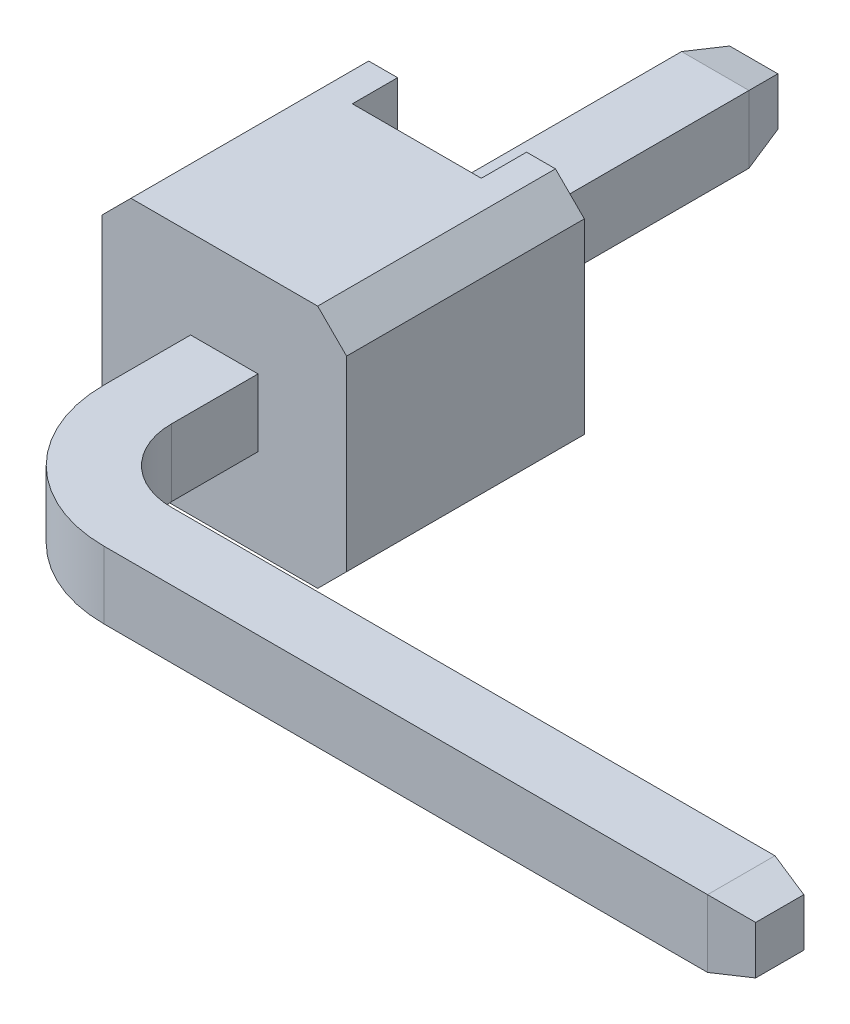
ISO-10303-21;
HEADER;
FILE_DESCRIPTION(('STEP AP214'),'2;1');
FILE_NAME('part.step','',(''),(''),'','','');
FILE_SCHEMA(('AUTOMOTIVE_DESIGN { 1 0 10303 214 1 1 1 1 }'));
ENDSEC;
DATA;
#1=APPLICATION_CONTEXT('core data for automotive mechanical design processes');
#2=APPLICATION_PROTOCOL_DEFINITION('international standard','automotive_design',2000,#1);
#3=PRODUCT_CONTEXT('',#1,'mechanical');
#4=PRODUCT('Part','Part','',(#3));
#5=PRODUCT_RELATED_PRODUCT_CATEGORY('part','',(#4));
#6=PRODUCT_DEFINITION_FORMATION('','',#4);
#7=PRODUCT_DEFINITION_CONTEXT('part definition',#1,'design');
#8=PRODUCT_DEFINITION('design','',#6,#7);
#9=PRODUCT_DEFINITION_SHAPE('','',#8);
#10=(LENGTH_UNIT() NAMED_UNIT(*) SI_UNIT(.MILLI.,.METRE.));
#11=(NAMED_UNIT(*) PLANE_ANGLE_UNIT() SI_UNIT($,.RADIAN.));
#12=(NAMED_UNIT(*) SI_UNIT($,.STERADIAN.) SOLID_ANGLE_UNIT());
#13=UNCERTAINTY_MEASURE_WITH_UNIT(LENGTH_MEASURE(1.E-05),#10,'distance_accuracy_value','');
#14=(GEOMETRIC_REPRESENTATION_CONTEXT(3) GLOBAL_UNCERTAINTY_ASSIGNED_CONTEXT((#13)) GLOBAL_UNIT_ASSIGNED_CONTEXT((#10,
#11,#12)) REPRESENTATION_CONTEXT('',''));
#15=CARTESIAN_POINT('',(0.,0.,0.));
#16=DIRECTION('',(0.,0.,1.));
#17=DIRECTION('',(1.,0.,0.));
#18=AXIS2_PLACEMENT_3D('',#15,#16,#17);
#19=CARTESIAN_POINT('',(0.,0.,0.5));
#20=DIRECTION('',(0.,0.,1.));
#21=DIRECTION('',(1.,0.,0.));
#22=AXIS2_PLACEMENT_3D('',#19,#20,#21);
#23=PLANE('',#22);
#24=DIRECTION('',(0.,-1.,0.));
#25=VECTOR('',#24,1.);
#26=CARTESIAN_POINT('',(-0.67,0.,0.5));
#27=LINE('',#26,#25);
#28=CARTESIAN_POINT('',(-0.67,1.27,0.5));
#29=VERTEX_POINT('',#28);
#30=CARTESIAN_POINT('',(-0.67,-1.27,0.5));
#31=VERTEX_POINT('',#30);
#32=EDGE_CURVE('E11',#29,#31,#27,.T.);
#33=ORIENTED_EDGE('',*,*,#32,.F.);
#34=DIRECTION('',(-1.,0.,0.));
#35=VECTOR('',#34,1.);
#36=CARTESIAN_POINT('',(-0.97,1.27,0.5));
#37=LINE('',#36,#35);
#38=CARTESIAN_POINT('',(0.67,1.27,0.5));
#39=VERTEX_POINT('',#38);
#40=EDGE_CURVE('E24',#39,#29,#37,.T.);
#41=ORIENTED_EDGE('',*,*,#40,.F.);
#42=DIRECTION('',(0.,1.,0.));
#43=VECTOR('',#42,1.);
#44=CARTESIAN_POINT('',(0.67,0.,0.5));
#45=LINE('',#44,#43);
#46=CARTESIAN_POINT('',(0.67,-1.27,0.5));
#47=VERTEX_POINT('',#46);
#48=EDGE_CURVE('E412',#47,#39,#45,.T.);
#49=ORIENTED_EDGE('',*,*,#48,.F.);
#50=DIRECTION('',(1.,0.,0.));
#51=VECTOR('',#50,1.);
#52=CARTESIAN_POINT('',(-0.97,-1.27,0.5));
#53=LINE('',#52,#51);
#54=EDGE_CURVE('E409',#31,#47,#53,.T.);
#55=ORIENTED_EDGE('',*,*,#54,.F.);
#56=EDGE_LOOP('',(#33,#41,#49,#55));
#57=FACE_BOUND('',#56,.T.);
#58=DIRECTION('',(0.,-1.,0.));
#59=VECTOR('',#58,1.);
#60=CARTESIAN_POINT('',(0.35,0.,0.5));
#61=LINE('',#60,#59);
#62=CARTESIAN_POINT('',(0.35,0.35,0.5));
#63=VERTEX_POINT('',#62);
#64=CARTESIAN_POINT('',(0.35,-0.35,0.5));
#65=VERTEX_POINT('',#64);
#66=EDGE_CURVE('E407',#63,#65,#61,.T.);
#67=ORIENTED_EDGE('',*,*,#66,.F.);
#68=DIRECTION('',(1.,0.,0.));
#69=VECTOR('',#68,1.);
#70=CARTESIAN_POINT('',(0.,0.35,0.5));
#71=LINE('',#70,#69);
#72=CARTESIAN_POINT('',(-0.35,0.35,0.5));
#73=VERTEX_POINT('',#72);
#74=EDGE_CURVE('E404',#73,#63,#71,.T.);
#75=ORIENTED_EDGE('',*,*,#74,.F.);
#76=DIRECTION('',(0.,1.,0.));
#77=VECTOR('',#76,1.);
#78=CARTESIAN_POINT('',(-0.35,0.,0.5));
#79=LINE('',#78,#77);
#80=CARTESIAN_POINT('',(-0.35,-0.35,0.5));
#81=VERTEX_POINT('',#80);
#82=EDGE_CURVE('E401',#81,#73,#79,.T.);
#83=ORIENTED_EDGE('',*,*,#82,.F.);
#84=DIRECTION('',(-1.,0.,0.));
#85=VECTOR('',#84,1.);
#86=CARTESIAN_POINT('',(0.,-0.35,0.5));
#87=LINE('',#86,#85);
#88=EDGE_CURVE('E398',#65,#81,#87,.T.);
#89=ORIENTED_EDGE('',*,*,#88,.F.);
#90=EDGE_LOOP('',(#67,#75,#83,#89));
#91=FACE_BOUND('',#90,.T.);
#92=ADVANCED_FACE('F17',(#57,#91),#23,.F.);
#93=CARTESIAN_POINT('',(0.,0.,2.5));
#94=DIRECTION('',(0.,0.,1.));
#95=DIRECTION('',(1.,0.,0.));
#96=AXIS2_PLACEMENT_3D('',#93,#94,#95);
#97=PLANE('',#96);
#98=DIRECTION('',(0.707106781186547,-0.707106781186548,0.));
#99=VECTOR('',#98,1.);
#100=CARTESIAN_POINT('',(-1.27,-0.97,2.5));
#101=LINE('',#100,#99);
#102=CARTESIAN_POINT('',(-1.27,-0.97,2.5));
#103=VERTEX_POINT('',#102);
#104=CARTESIAN_POINT('',(-0.97,-1.27,2.5));
#105=VERTEX_POINT('',#104);
#106=EDGE_CURVE('E396',#103,#105,#101,.T.);
#107=ORIENTED_EDGE('',*,*,#106,.T.);
#108=DIRECTION('',(1.,0.,0.));
#109=VECTOR('',#108,1.);
#110=CARTESIAN_POINT('',(-0.97,-1.27,2.5));
#111=LINE('',#110,#109);
#112=CARTESIAN_POINT('',(0.97,-1.27,2.5));
#113=VERTEX_POINT('',#112);
#114=EDGE_CURVE('E394',#105,#113,#111,.T.);
#115=ORIENTED_EDGE('',*,*,#114,.T.);
#116=DIRECTION('',(0.707106781186548,0.707106781186548,0.));
#117=VECTOR('',#116,1.);
#118=CARTESIAN_POINT('',(0.97,-1.27,2.5));
#119=LINE('',#118,#117);
#120=CARTESIAN_POINT('',(1.27,-0.97,2.5));
#121=VERTEX_POINT('',#120);
#122=EDGE_CURVE('E392',#113,#121,#119,.T.);
#123=ORIENTED_EDGE('',*,*,#122,.T.);
#124=DIRECTION('',(0.,1.,0.));
#125=VECTOR('',#124,1.);
#126=CARTESIAN_POINT('',(1.27,0.97,2.5));
#127=LINE('',#126,#125);
#128=CARTESIAN_POINT('',(1.27,0.97,2.5));
#129=VERTEX_POINT('',#128);
#130=EDGE_CURVE('E390',#121,#129,#127,.T.);
#131=ORIENTED_EDGE('',*,*,#130,.T.);
#132=DIRECTION('',(-0.707106781186548,0.707106781186548,0.));
#133=VECTOR('',#132,1.);
#134=CARTESIAN_POINT('',(0.97,1.27,2.5));
#135=LINE('',#134,#133);
#136=CARTESIAN_POINT('',(0.97,1.27,2.5));
#137=VERTEX_POINT('',#136);
#138=EDGE_CURVE('E388',#129,#137,#135,.T.);
#139=ORIENTED_EDGE('',*,*,#138,.T.);
#140=DIRECTION('',(-1.,0.,0.));
#141=VECTOR('',#140,1.);
#142=CARTESIAN_POINT('',(-0.97,1.27,2.5));
#143=LINE('',#142,#141);
#144=CARTESIAN_POINT('',(-0.97,1.27,2.5));
#145=VERTEX_POINT('',#144);
#146=EDGE_CURVE('E386',#137,#145,#143,.T.);
#147=ORIENTED_EDGE('',*,*,#146,.T.);
#148=DIRECTION('',(-0.707106781186548,-0.707106781186548,0.));
#149=VECTOR('',#148,1.);
#150=CARTESIAN_POINT('',(-1.27,0.97,2.5));
#151=LINE('',#150,#149);
#152=CARTESIAN_POINT('',(-1.27,0.97,2.5));
#153=VERTEX_POINT('',#152);
#154=EDGE_CURVE('E384',#145,#153,#151,.T.);
#155=ORIENTED_EDGE('',*,*,#154,.T.);
#156=DIRECTION('',(0.,-1.,0.));
#157=VECTOR('',#156,1.);
#158=CARTESIAN_POINT('',(-1.27,0.97,2.5));
#159=LINE('',#158,#157);
#160=EDGE_CURVE('E381',#153,#103,#159,.T.);
#161=ORIENTED_EDGE('',*,*,#160,.T.);
#162=EDGE_LOOP('',(#107,#115,#123,#131,#139,#147,#155,#161));
#163=FACE_BOUND('',#162,.T.);
#164=DIRECTION('',(1.,0.,0.));
#165=VECTOR('',#164,1.);
#166=CARTESIAN_POINT('',(0.,0.35,2.5));
#167=LINE('',#166,#165);
#168=CARTESIAN_POINT('',(-0.349999999999999,0.35,2.5));
#169=VERTEX_POINT('',#168);
#170=CARTESIAN_POINT('',(0.350000000000001,0.35,2.5));
#171=VERTEX_POINT('',#170);
#172=EDGE_CURVE('E379',#169,#171,#167,.T.);
#173=ORIENTED_EDGE('',*,*,#172,.T.);
#174=DIRECTION('',(0.,-1.,0.));
#175=VECTOR('',#174,1.);
#176=CARTESIAN_POINT('',(0.350000000000001,0.,2.5));
#177=LINE('',#176,#175);
#178=CARTESIAN_POINT('',(0.350000000000001,-0.35,2.5));
#179=VERTEX_POINT('',#178);
#180=EDGE_CURVE('E377',#171,#179,#177,.T.);
#181=ORIENTED_EDGE('',*,*,#180,.T.);
#182=DIRECTION('',(-1.,0.,0.));
#183=VECTOR('',#182,1.);
#184=CARTESIAN_POINT('',(0.,-0.35,2.5));
#185=LINE('',#184,#183);
#186=CARTESIAN_POINT('',(-0.35,-0.35,2.5));
#187=VERTEX_POINT('',#186);
#188=EDGE_CURVE('E375',#179,#187,#185,.T.);
#189=ORIENTED_EDGE('',*,*,#188,.T.);
#190=DIRECTION('',(0.,1.,0.));
#191=VECTOR('',#190,1.);
#192=CARTESIAN_POINT('',(-0.349999999999999,0.,2.5));
#193=LINE('',#192,#191);
#194=EDGE_CURVE('E372',#187,#169,#193,.T.);
#195=ORIENTED_EDGE('',*,*,#194,.T.);
#196=EDGE_LOOP('',(#173,#181,#189,#195));
#197=FACE_BOUND('',#196,.T.);
#198=ADVANCED_FACE('F435',(#163,#197),#97,.T.);
#199=CARTESIAN_POINT('',(-1.27,-0.97,2.5));
#200=DIRECTION('',(0.707106781186548,0.707106781186548,0.));
#201=DIRECTION('',(-0.707106781186548,0.707106781186548,0.));
#202=AXIS2_PLACEMENT_3D('',#199,#200,#201);
#203=PLANE('',#202);
#204=DIRECTION('',(0.,0.,-1.));
#205=VECTOR('',#204,1.);
#206=CARTESIAN_POINT('',(-1.27,-0.97,2.5));
#207=LINE('',#206,#205);
#208=CARTESIAN_POINT('',(-1.27,-0.97,0.03));
#209=VERTEX_POINT('',#208);
#210=EDGE_CURVE('E370',#103,#209,#207,.T.);
#211=ORIENTED_EDGE('',*,*,#210,.T.);
#212=DIRECTION('',(0.707106781186547,-0.707106781186548,0.));
#213=VECTOR('',#212,1.);
#214=CARTESIAN_POINT('',(-1.27,-0.97,0.03));
#215=LINE('',#214,#213);
#216=CARTESIAN_POINT('',(-0.97,-1.27,0.03));
#217=VERTEX_POINT('',#216);
#218=EDGE_CURVE('E368',#209,#217,#215,.T.);
#219=ORIENTED_EDGE('',*,*,#218,.T.);
#220=DIRECTION('',(0.,0.,-1.));
#221=VECTOR('',#220,1.);
#222=CARTESIAN_POINT('',(-0.97,-1.27,2.5));
#223=LINE('',#222,#221);
#224=EDGE_CURVE('E365',#105,#217,#223,.T.);
#225=ORIENTED_EDGE('',*,*,#224,.F.);
#226=ORIENTED_EDGE('',*,*,#106,.F.);
#227=EDGE_LOOP('',(#211,#219,#225,#226));
#228=FACE_BOUND('',#227,.T.);
#229=ADVANCED_FACE('F441',(#228),#203,.F.);
#230=CARTESIAN_POINT('',(-0.97,-1.27,2.5));
#231=DIRECTION('',(0.,1.,0.));
#232=DIRECTION('',(0.,0.,1.));
#233=AXIS2_PLACEMENT_3D('',#230,#231,#232);
#234=PLANE('',#233);
#235=ORIENTED_EDGE('',*,*,#224,.T.);
#236=DIRECTION('',(1.,0.,0.));
#237=VECTOR('',#236,1.);
#238=CARTESIAN_POINT('',(-0.97,-1.27,0.03));
#239=LINE('',#238,#237);
#240=CARTESIAN_POINT('',(-0.67,-1.27,0.03));
#241=VERTEX_POINT('',#240);
#242=EDGE_CURVE('E363',#217,#241,#239,.T.);
#243=ORIENTED_EDGE('',*,*,#242,.T.);
#244=DIRECTION('',(0.,0.,-1.));
#245=VECTOR('',#244,1.);
#246=CARTESIAN_POINT('',(-0.67,-1.27,0.53));
#247=LINE('',#246,#245);
#248=EDGE_CURVE('E361',#31,#241,#247,.T.);
#249=ORIENTED_EDGE('',*,*,#248,.F.);
#250=ORIENTED_EDGE('',*,*,#54,.T.);
#251=DIRECTION('',(0.,0.,-1.));
#252=VECTOR('',#251,1.);
#253=CARTESIAN_POINT('',(0.67,-1.27,0.53));
#254=LINE('',#253,#252);
#255=CARTESIAN_POINT('',(0.67,-1.27,0.03));
#256=VERTEX_POINT('',#255);
#257=EDGE_CURVE('E359',#47,#256,#254,.T.);
#258=ORIENTED_EDGE('',*,*,#257,.T.);
#259=DIRECTION('',(1.,0.,0.));
#260=VECTOR('',#259,1.);
#261=CARTESIAN_POINT('',(0.67,-1.27,0.03));
#262=LINE('',#261,#260);
#263=CARTESIAN_POINT('',(0.97,-1.27,0.03));
#264=VERTEX_POINT('',#263);
#265=EDGE_CURVE('E357',#256,#264,#262,.T.);
#266=ORIENTED_EDGE('',*,*,#265,.T.);
#267=DIRECTION('',(0.,0.,-1.));
#268=VECTOR('',#267,1.);
#269=CARTESIAN_POINT('',(0.97,-1.27,2.5));
#270=LINE('',#269,#268);
#271=EDGE_CURVE('E354',#113,#264,#270,.T.);
#272=ORIENTED_EDGE('',*,*,#271,.F.);
#273=ORIENTED_EDGE('',*,*,#114,.F.);
#274=EDGE_LOOP('',(#235,#243,#249,#250,#258,#266,#272,#273));
#275=FACE_BOUND('',#274,.T.);
#276=ADVANCED_FACE('F447',(#275),#234,.F.);
#277=CARTESIAN_POINT('',(0.970000000000001,-1.27,2.5));
#278=DIRECTION('',(-0.707106781186548,0.707106781186548,0.));
#279=DIRECTION('',(-0.707106781186548,-0.707106781186548,0.));
#280=AXIS2_PLACEMENT_3D('',#277,#278,#279);
#281=PLANE('',#280);
#282=ORIENTED_EDGE('',*,*,#271,.T.);
#283=DIRECTION('',(0.707106781186548,0.707106781186548,0.));
#284=VECTOR('',#283,1.);
#285=CARTESIAN_POINT('',(0.97,-1.27,0.03));
#286=LINE('',#285,#284);
#287=CARTESIAN_POINT('',(1.27,-0.97,0.03));
#288=VERTEX_POINT('',#287);
#289=EDGE_CURVE('E352',#264,#288,#286,.T.);
#290=ORIENTED_EDGE('',*,*,#289,.T.);
#291=DIRECTION('',(0.,0.,-1.));
#292=VECTOR('',#291,1.);
#293=CARTESIAN_POINT('',(1.27,-0.97,2.5));
#294=LINE('',#293,#292);
#295=EDGE_CURVE('E349',#121,#288,#294,.T.);
#296=ORIENTED_EDGE('',*,*,#295,.F.);
#297=ORIENTED_EDGE('',*,*,#122,.F.);
#298=EDGE_LOOP('',(#282,#290,#296,#297));
#299=FACE_BOUND('',#298,.T.);
#300=ADVANCED_FACE('F451',(#299),#281,.F.);
#301=CARTESIAN_POINT('',(1.27,0.970000000000001,2.5));
#302=DIRECTION('',(-1.,0.,0.));
#303=DIRECTION('',(0.,-1.,0.));
#304=AXIS2_PLACEMENT_3D('',#301,#302,#303);
#305=PLANE('',#304);
#306=ORIENTED_EDGE('',*,*,#295,.T.);
#307=DIRECTION('',(0.,1.,0.));
#308=VECTOR('',#307,1.);
#309=CARTESIAN_POINT('',(1.27,-0.97,0.03));
#310=LINE('',#309,#308);
#311=CARTESIAN_POINT('',(1.27,0.97,0.03));
#312=VERTEX_POINT('',#311);
#313=EDGE_CURVE('E347',#288,#312,#310,.T.);
#314=ORIENTED_EDGE('',*,*,#313,.T.);
#315=DIRECTION('',(0.,0.,-1.));
#316=VECTOR('',#315,1.);
#317=CARTESIAN_POINT('',(1.27,0.97,2.5));
#318=LINE('',#317,#316);
#319=EDGE_CURVE('E344',#129,#312,#318,.T.);
#320=ORIENTED_EDGE('',*,*,#319,.F.);
#321=ORIENTED_EDGE('',*,*,#130,.F.);
#322=EDGE_LOOP('',(#306,#314,#320,#321));
#323=FACE_BOUND('',#322,.T.);
#324=ADVANCED_FACE('F461',(#323),#305,.F.);
#325=CARTESIAN_POINT('',(0.97,1.27,2.5));
#326=DIRECTION('',(-0.707106781186548,-0.707106781186548,0.));
#327=DIRECTION('',(0.707106781186548,-0.707106781186548,0.));
#328=AXIS2_PLACEMENT_3D('',#325,#326,#327);
#329=PLANE('',#328);
#330=ORIENTED_EDGE('',*,*,#319,.T.);
#331=DIRECTION('',(-0.707106781186548,0.707106781186548,0.));
#332=VECTOR('',#331,1.);
#333=CARTESIAN_POINT('',(1.27,0.97,0.03));
#334=LINE('',#333,#332);
#335=CARTESIAN_POINT('',(0.97,1.27,0.03));
#336=VERTEX_POINT('',#335);
#337=EDGE_CURVE('E342',#312,#336,#334,.T.);
#338=ORIENTED_EDGE('',*,*,#337,.T.);
#339=DIRECTION('',(0.,0.,-1.));
#340=VECTOR('',#339,1.);
#341=CARTESIAN_POINT('',(0.97,1.27,2.5));
#342=LINE('',#341,#340);
#343=EDGE_CURVE('E339',#137,#336,#342,.T.);
#344=ORIENTED_EDGE('',*,*,#343,.F.);
#345=ORIENTED_EDGE('',*,*,#138,.F.);
#346=EDGE_LOOP('',(#330,#338,#344,#345));
#347=FACE_BOUND('',#346,.T.);
#348=ADVANCED_FACE('F465',(#347),#329,.F.);
#349=CARTESIAN_POINT('',(-0.97,1.27,2.5));
#350=DIRECTION('',(0.,-1.,0.));
#351=DIRECTION('',(0.,0.,-1.));
#352=AXIS2_PLACEMENT_3D('',#349,#350,#351);
#353=PLANE('',#352);
#354=ORIENTED_EDGE('',*,*,#40,.T.);
#355=DIRECTION('',(0.,0.,-1.));
#356=VECTOR('',#355,1.);
#357=CARTESIAN_POINT('',(-0.67,1.27,0.53));
#358=LINE('',#357,#356);
#359=CARTESIAN_POINT('',(-0.67,1.27,0.03));
#360=VERTEX_POINT('',#359);
#361=EDGE_CURVE('E337',#29,#360,#358,.T.);
#362=ORIENTED_EDGE('',*,*,#361,.T.);
#363=DIRECTION('',(-1.,0.,0.));
#364=VECTOR('',#363,1.);
#365=CARTESIAN_POINT('',(-0.67,1.27,0.03));
#366=LINE('',#365,#364);
#367=CARTESIAN_POINT('',(-0.97,1.27,0.03));
#368=VERTEX_POINT('',#367);
#369=EDGE_CURVE('E335',#360,#368,#366,.T.);
#370=ORIENTED_EDGE('',*,*,#369,.T.);
#371=DIRECTION('',(0.,0.,-1.));
#372=VECTOR('',#371,1.);
#373=CARTESIAN_POINT('',(-0.97,1.27,2.5));
#374=LINE('',#373,#372);
#375=EDGE_CURVE('E332',#145,#368,#374,.T.);
#376=ORIENTED_EDGE('',*,*,#375,.F.);
#377=ORIENTED_EDGE('',*,*,#146,.F.);
#378=ORIENTED_EDGE('',*,*,#343,.T.);
#379=DIRECTION('',(-1.,0.,0.));
#380=VECTOR('',#379,1.);
#381=CARTESIAN_POINT('',(0.97,1.27,0.03));
#382=LINE('',#381,#380);
#383=CARTESIAN_POINT('',(0.67,1.27,0.03));
#384=VERTEX_POINT('',#383);
#385=EDGE_CURVE('E330',#336,#384,#382,.T.);
#386=ORIENTED_EDGE('',*,*,#385,.T.);
#387=DIRECTION('',(0.,0.,-1.));
#388=VECTOR('',#387,1.);
#389=CARTESIAN_POINT('',(0.67,1.27,0.53));
#390=LINE('',#389,#388);
#391=EDGE_CURVE('E327',#39,#384,#390,.T.);
#392=ORIENTED_EDGE('',*,*,#391,.F.);
#393=EDGE_LOOP('',(#354,#362,#370,#376,#377,#378,#386,#392));
#394=FACE_BOUND('',#393,.T.);
#395=ADVANCED_FACE('F416',(#394),#353,.F.);
#396=CARTESIAN_POINT('',(-1.27,0.970000000000001,2.5));
#397=DIRECTION('',(0.707106781186548,-0.707106781186548,0.));
#398=DIRECTION('',(0.707106781186548,0.707106781186548,0.));
#399=AXIS2_PLACEMENT_3D('',#396,#397,#398);
#400=PLANE('',#399);
#401=ORIENTED_EDGE('',*,*,#375,.T.);
#402=DIRECTION('',(-0.707106781186548,-0.707106781186548,0.));
#403=VECTOR('',#402,1.);
#404=CARTESIAN_POINT('',(-0.97,1.27,0.03));
#405=LINE('',#404,#403);
#406=CARTESIAN_POINT('',(-1.27,0.97,0.03));
#407=VERTEX_POINT('',#406);
#408=EDGE_CURVE('E325',#368,#407,#405,.T.);
#409=ORIENTED_EDGE('',*,*,#408,.T.);
#410=DIRECTION('',(0.,0.,-1.));
#411=VECTOR('',#410,1.);
#412=CARTESIAN_POINT('',(-1.27,0.97,2.5));
#413=LINE('',#412,#411);
#414=EDGE_CURVE('E322',#153,#407,#413,.T.);
#415=ORIENTED_EDGE('',*,*,#414,.F.);
#416=ORIENTED_EDGE('',*,*,#154,.F.);
#417=EDGE_LOOP('',(#401,#409,#415,#416));
#418=FACE_BOUND('',#417,.T.);
#419=ADVANCED_FACE('F431',(#418),#400,.F.);
#420=CARTESIAN_POINT('',(-1.27,0.970000000000001,2.5));
#421=DIRECTION('',(1.,0.,0.));
#422=DIRECTION('',(0.,1.,0.));
#423=AXIS2_PLACEMENT_3D('',#420,#421,#422);
#424=PLANE('',#423);
#425=ORIENTED_EDGE('',*,*,#414,.T.);
#426=DIRECTION('',(0.,-1.,0.));
#427=VECTOR('',#426,1.);
#428=CARTESIAN_POINT('',(-1.27,0.97,0.03));
#429=LINE('',#428,#427);
#430=EDGE_CURVE('E319',#407,#209,#429,.T.);
#431=ORIENTED_EDGE('',*,*,#430,.T.);
#432=ORIENTED_EDGE('',*,*,#210,.F.);
#433=ORIENTED_EDGE('',*,*,#160,.F.);
#434=EDGE_LOOP('',(#425,#431,#432,#433));
#435=FACE_BOUND('',#434,.T.);
#436=ADVANCED_FACE('F439',(#435),#424,.F.);
#437=CARTESIAN_POINT('',(0.67,1.27,0.53));
#438=DIRECTION('',(1.,0.,0.));
#439=DIRECTION('',(0.,0.,-1.));
#440=AXIS2_PLACEMENT_3D('',#437,#438,#439);
#441=PLANE('',#440);
#442=ORIENTED_EDGE('',*,*,#257,.F.);
#443=ORIENTED_EDGE('',*,*,#48,.T.);
#444=ORIENTED_EDGE('',*,*,#391,.T.);
#445=DIRECTION('',(0.,-1.,0.));
#446=VECTOR('',#445,1.);
#447=CARTESIAN_POINT('',(0.67,1.27,0.03));
#448=LINE('',#447,#446);
#449=EDGE_CURVE('E316',#384,#256,#448,.T.);
#450=ORIENTED_EDGE('',*,*,#449,.T.);
#451=EDGE_LOOP('',(#442,#443,#444,#450));
#452=FACE_BOUND('',#451,.T.);
#453=ADVANCED_FACE('F469',(#452),#441,.F.);
#454=CARTESIAN_POINT('',(0.,0.,0.03));
#455=DIRECTION('',(0.,0.,1.));
#456=DIRECTION('',(1.,0.,0.));
#457=AXIS2_PLACEMENT_3D('',#454,#455,#456);
#458=PLANE('',#457);
#459=ORIENTED_EDGE('',*,*,#449,.F.);
#460=ORIENTED_EDGE('',*,*,#385,.F.);
#461=ORIENTED_EDGE('',*,*,#337,.F.);
#462=ORIENTED_EDGE('',*,*,#313,.F.);
#463=ORIENTED_EDGE('',*,*,#289,.F.);
#464=ORIENTED_EDGE('',*,*,#265,.F.);
#465=EDGE_LOOP('',(#459,#460,#461,#462,#463,#464));
#466=FACE_BOUND('',#465,.T.);
#467=ADVANCED_FACE('F456',(#466),#458,.F.);
#468=CARTESIAN_POINT('',(-0.67,1.27,0.53));
#469=DIRECTION('',(-1.,0.,0.));
#470=DIRECTION('',(0.,0.,1.));
#471=AXIS2_PLACEMENT_3D('',#468,#469,#470);
#472=PLANE('',#471);
#473=ORIENTED_EDGE('',*,*,#361,.F.);
#474=ORIENTED_EDGE('',*,*,#32,.T.);
#475=ORIENTED_EDGE('',*,*,#248,.T.);
#476=DIRECTION('',(0.,1.,0.));
#477=VECTOR('',#476,1.);
#478=CARTESIAN_POINT('',(-0.67,1.27,0.03));
#479=LINE('',#478,#477);
#480=EDGE_CURVE('E313',#241,#360,#479,.T.);
#481=ORIENTED_EDGE('',*,*,#480,.T.);
#482=EDGE_LOOP('',(#473,#474,#475,#481));
#483=FACE_BOUND('',#482,.T.);
#484=ADVANCED_FACE('F418',(#483),#472,.F.);
#485=CARTESIAN_POINT('',(0.,0.,0.03));
#486=DIRECTION('',(0.,0.,1.));
#487=DIRECTION('',(1.,0.,0.));
#488=AXIS2_PLACEMENT_3D('',#485,#486,#487);
#489=PLANE('',#488);
#490=ORIENTED_EDGE('',*,*,#480,.F.);
#491=ORIENTED_EDGE('',*,*,#242,.F.);
#492=ORIENTED_EDGE('',*,*,#218,.F.);
#493=ORIENTED_EDGE('',*,*,#430,.F.);
#494=ORIENTED_EDGE('',*,*,#408,.F.);
#495=ORIENTED_EDGE('',*,*,#369,.F.);
#496=EDGE_LOOP('',(#490,#491,#492,#493,#494,#495));
#497=FACE_BOUND('',#496,.T.);
#498=ADVANCED_FACE('F423',(#497),#489,.F.);
#499=CARTESIAN_POINT('',(1.1,0.,3.4));
#500=DIRECTION('',(0.,1.,0.));
#501=DIRECTION('',(0.,0.,1.));
#502=AXIS2_PLACEMENT_3D('',#499,#500,#501);
#503=CYLINDRICAL_SURFACE('',#502,1.45);
#504=DIRECTION('',(0.,-1.,0.));
#505=VECTOR('',#504,1.);
#506=CARTESIAN_POINT('',(-0.349999999999999,0.35,3.4));
#507=LINE('',#506,#505);
#508=CARTESIAN_POINT('',(-0.349999999999999,0.35,3.4));
#509=VERTEX_POINT('',#508);
#510=CARTESIAN_POINT('',(-0.349999999999999,-0.35,3.4));
#511=VERTEX_POINT('',#510);
#512=EDGE_CURVE('E311',#509,#511,#507,.T.);
#513=ORIENTED_EDGE('',*,*,#512,.T.);
#514=CARTESIAN_POINT('',(1.1,-0.35,3.4));
#515=DIRECTION('',(0.,1.,0.));
#516=DIRECTION('',(0.,0.,1.));
#517=AXIS2_PLACEMENT_3D('',#514,#515,#516);
#518=CIRCLE('',#517,1.45);
#519=CARTESIAN_POINT('',(1.1,-0.35,4.85));
#520=VERTEX_POINT('',#519);
#521=EDGE_CURVE('E309',#511,#520,#518,.T.);
#522=ORIENTED_EDGE('',*,*,#521,.T.);
#523=DIRECTION('',(0.,-1.,0.));
#524=VECTOR('',#523,1.);
#525=CARTESIAN_POINT('',(1.1,0.35,4.85));
#526=LINE('',#525,#524);
#527=CARTESIAN_POINT('',(1.1,0.35,4.85));
#528=VERTEX_POINT('',#527);
#529=EDGE_CURVE('E306',#528,#520,#526,.T.);
#530=ORIENTED_EDGE('',*,*,#529,.F.);
#531=CARTESIAN_POINT('',(1.1,0.35,3.4));
#532=DIRECTION('',(0.,1.,0.));
#533=DIRECTION('',(0.,0.,1.));
#534=AXIS2_PLACEMENT_3D('',#531,#532,#533);
#535=CIRCLE('',#534,1.45);
#536=EDGE_CURVE('E303',#509,#528,#535,.T.);
#537=ORIENTED_EDGE('',*,*,#536,.F.);
#538=EDGE_LOOP('',(#513,#522,#530,#537));
#539=FACE_BOUND('',#538,.T.);
#540=ADVANCED_FACE('F537',(#539),#503,.T.);
#541=CARTESIAN_POINT('',(1.1,0.35,4.85));
#542=DIRECTION('',(0.,0.,1.));
#543=DIRECTION('',(0.,-1.,0.));
#544=AXIS2_PLACEMENT_3D('',#541,#542,#543);
#545=PLANE('',#544);
#546=DIRECTION('',(1.,0.,0.));
#547=VECTOR('',#546,1.);
#548=CARTESIAN_POINT('',(1.1,-0.35,4.85));
#549=LINE('',#548,#547);
#550=CARTESIAN_POINT('',(7.36999999999999,-0.35,4.85));
#551=VERTEX_POINT('',#550);
#552=EDGE_CURVE('E301',#520,#551,#549,.T.);
#553=ORIENTED_EDGE('',*,*,#552,.T.);
#554=DIRECTION('',(0.,1.,0.));
#555=VECTOR('',#554,1.);
#556=CARTESIAN_POINT('',(7.36999999999999,0.35,4.85));
#557=LINE('',#556,#555);
#558=CARTESIAN_POINT('',(7.36999999999999,0.35,4.85));
#559=VERTEX_POINT('',#558);
#560=EDGE_CURVE('E299',#551,#559,#557,.T.);
#561=ORIENTED_EDGE('',*,*,#560,.T.);
#562=DIRECTION('',(1.,0.,0.));
#563=VECTOR('',#562,1.);
#564=CARTESIAN_POINT('',(1.1,0.35,4.85));
#565=LINE('',#564,#563);
#566=EDGE_CURVE('E296',#528,#559,#565,.T.);
#567=ORIENTED_EDGE('',*,*,#566,.F.);
#568=ORIENTED_EDGE('',*,*,#529,.T.);
#569=EDGE_LOOP('',(#553,#561,#567,#568));
#570=FACE_BOUND('',#569,.T.);
#571=ADVANCED_FACE('F533',(#570),#545,.T.);
#572=CARTESIAN_POINT('',(7.77,0.,4.5));
#573=DIRECTION('',(1.,0.,0.));
#574=DIRECTION('',(0.,0.,-1.));
#575=AXIS2_PLACEMENT_3D('',#572,#573,#574);
#576=PLANE('',#575);
#577=DIRECTION('',(0.,-1.,0.));
#578=VECTOR('',#577,1.);
#579=CARTESIAN_POINT('',(7.77,0.,4.75));
#580=LINE('',#579,#578);
#581=CARTESIAN_POINT('',(7.77,0.25,4.75));
#582=VERTEX_POINT('',#581);
#583=CARTESIAN_POINT('',(7.77,-0.25,4.75));
#584=VERTEX_POINT('',#583);
#585=EDGE_CURVE('E294',#582,#584,#580,.T.);
#586=ORIENTED_EDGE('',*,*,#585,.T.);
#587=DIRECTION('',(0.,0.,-1.));
#588=VECTOR('',#587,1.);
#589=CARTESIAN_POINT('',(7.77,-0.25,4.15));
#590=LINE('',#589,#588);
#591=CARTESIAN_POINT('',(7.77,-0.25,4.25));
#592=VERTEX_POINT('',#591);
#593=EDGE_CURVE('E292',#584,#592,#590,.T.);
#594=ORIENTED_EDGE('',*,*,#593,.T.);
#595=DIRECTION('',(0.,1.,0.));
#596=VECTOR('',#595,1.);
#597=CARTESIAN_POINT('',(7.77,0.,4.25));
#598=LINE('',#597,#596);
#599=CARTESIAN_POINT('',(7.77,0.25,4.25));
#600=VERTEX_POINT('',#599);
#601=EDGE_CURVE('E290',#592,#600,#598,.T.);
#602=ORIENTED_EDGE('',*,*,#601,.T.);
#603=DIRECTION('',(0.,0.,1.));
#604=VECTOR('',#603,1.);
#605=CARTESIAN_POINT('',(7.77,0.25,4.85));
#606=LINE('',#605,#604);
#607=EDGE_CURVE('E287',#600,#582,#606,.T.);
#608=ORIENTED_EDGE('',*,*,#607,.T.);
#609=EDGE_LOOP('',(#586,#594,#602,#608));
#610=FACE_BOUND('',#609,.T.);
#611=ADVANCED_FACE('F529',(#610),#576,.T.);
#612=CARTESIAN_POINT('',(1.1,0.35,4.15));
#613=DIRECTION('',(0.,0.,-1.));
#614=DIRECTION('',(0.,1.,0.));
#615=AXIS2_PLACEMENT_3D('',#612,#613,#614);
#616=PLANE('',#615);
#617=DIRECTION('',(1.,0.,0.));
#618=VECTOR('',#617,1.);
#619=CARTESIAN_POINT('',(1.1,0.35,4.15));
#620=LINE('',#619,#618);
#621=CARTESIAN_POINT('',(1.1,0.35,4.15));
#622=VERTEX_POINT('',#621);
#623=CARTESIAN_POINT('',(7.36999999999999,0.35,4.15));
#624=VERTEX_POINT('',#623);
#625=EDGE_CURVE('E285',#622,#624,#620,.T.);
#626=ORIENTED_EDGE('',*,*,#625,.T.);
#627=DIRECTION('',(0.,-1.,0.));
#628=VECTOR('',#627,1.);
#629=CARTESIAN_POINT('',(7.36999999999999,0.35,4.15));
#630=LINE('',#629,#628);
#631=CARTESIAN_POINT('',(7.36999999999999,-0.35,4.15));
#632=VERTEX_POINT('',#631);
#633=EDGE_CURVE('E283',#624,#632,#630,.T.);
#634=ORIENTED_EDGE('',*,*,#633,.T.);
#635=DIRECTION('',(1.,0.,0.));
#636=VECTOR('',#635,1.);
#637=CARTESIAN_POINT('',(1.1,-0.35,4.15));
#638=LINE('',#637,#636);
#639=CARTESIAN_POINT('',(1.1,-0.35,4.15));
#640=VERTEX_POINT('',#639);
#641=EDGE_CURVE('E280',#640,#632,#638,.T.);
#642=ORIENTED_EDGE('',*,*,#641,.F.);
#643=DIRECTION('',(0.,1.,0.));
#644=VECTOR('',#643,1.);
#645=CARTESIAN_POINT('',(1.1,0.35,4.15));
#646=LINE('',#645,#644);
#647=EDGE_CURVE('E277',#640,#622,#646,.T.);
#648=ORIENTED_EDGE('',*,*,#647,.T.);
#649=EDGE_LOOP('',(#626,#634,#642,#648));
#650=FACE_BOUND('',#649,.T.);
#651=ADVANCED_FACE('F525',(#650),#616,.T.);
#652=CARTESIAN_POINT('',(1.1,0.,3.4));
#653=DIRECTION('',(0.,1.,0.));
#654=DIRECTION('',(0.,0.,1.));
#655=AXIS2_PLACEMENT_3D('',#652,#653,#654);
#656=CYLINDRICAL_SURFACE('',#655,0.75);
#657=DIRECTION('',(0.,1.,0.));
#658=VECTOR('',#657,1.);
#659=CARTESIAN_POINT('',(0.350000000000001,0.35,3.4));
#660=LINE('',#659,#658);
#661=CARTESIAN_POINT('',(0.350000000000001,-0.35,3.4));
#662=VERTEX_POINT('',#661);
#663=CARTESIAN_POINT('',(0.350000000000001,0.35,3.4));
#664=VERTEX_POINT('',#663);
#665=EDGE_CURVE('E274',#662,#664,#660,.T.);
#666=ORIENTED_EDGE('',*,*,#665,.T.);
#667=CARTESIAN_POINT('',(1.1,0.35,3.4));
#668=DIRECTION('',(0.,1.,0.));
#669=DIRECTION('',(0.,0.,1.));
#670=AXIS2_PLACEMENT_3D('',#667,#668,#669);
#671=CIRCLE('',#670,0.75);
#672=EDGE_CURVE('E271',#664,#622,#671,.T.);
#673=ORIENTED_EDGE('',*,*,#672,.T.);
#674=ORIENTED_EDGE('',*,*,#647,.F.);
#675=CARTESIAN_POINT('',(1.1,-0.35,3.4));
#676=DIRECTION('',(0.,1.,0.));
#677=DIRECTION('',(0.,0.,1.));
#678=AXIS2_PLACEMENT_3D('',#675,#676,#677);
#679=CIRCLE('',#678,0.75);
#680=EDGE_CURVE('E268',#662,#640,#679,.T.);
#681=ORIENTED_EDGE('',*,*,#680,.F.);
#682=EDGE_LOOP('',(#666,#673,#674,#681));
#683=FACE_BOUND('',#682,.T.);
#684=ADVANCED_FACE('F521',(#683),#656,.F.);
#685=CARTESIAN_POINT('',(-0.349999999999999,-0.35,3.4));
#686=DIRECTION('',(0.,1.,0.));
#687=DIRECTION('',(0.,0.,1.));
#688=AXIS2_PLACEMENT_3D('',#685,#686,#687);
#689=PLANE('',#688);
#690=ORIENTED_EDGE('',*,*,#641,.T.);
#691=DIRECTION('',(0.,0.,1.));
#692=VECTOR('',#691,1.);
#693=CARTESIAN_POINT('',(7.36999999999999,-0.35,4.85));
#694=LINE('',#693,#692);
#695=EDGE_CURVE('E265',#632,#551,#694,.T.);
#696=ORIENTED_EDGE('',*,*,#695,.T.);
#697=ORIENTED_EDGE('',*,*,#552,.F.);
#698=ORIENTED_EDGE('',*,*,#521,.F.);
#699=DIRECTION('',(0.,0.,-1.));
#700=VECTOR('',#699,1.);
#701=CARTESIAN_POINT('',(-0.349999999999999,-0.35,3.4));
#702=LINE('',#701,#700);
#703=EDGE_CURVE('E262',#511,#187,#702,.T.);
#704=ORIENTED_EDGE('',*,*,#703,.T.);
#705=ORIENTED_EDGE('',*,*,#188,.F.);
#706=DIRECTION('',(0.,0.,-1.));
#707=VECTOR('',#706,1.);
#708=CARTESIAN_POINT('',(0.350000000000001,-0.35,3.4));
#709=LINE('',#708,#707);
#710=EDGE_CURVE('E259',#662,#179,#709,.T.);
#711=ORIENTED_EDGE('',*,*,#710,.F.);
#712=ORIENTED_EDGE('',*,*,#680,.T.);
#713=EDGE_LOOP('',(#690,#696,#697,#698,#704,#705,#711,#712));
#714=FACE_BOUND('',#713,.T.);
#715=ADVANCED_FACE('F517',(#714),#689,.F.);
#716=CARTESIAN_POINT('',(-0.349999999999999,0.35,3.4));
#717=DIRECTION('',(1.,0.,0.));
#718=DIRECTION('',(0.,1.,0.));
#719=AXIS2_PLACEMENT_3D('',#716,#717,#718);
#720=PLANE('',#719);
#721=ORIENTED_EDGE('',*,*,#194,.F.);
#722=ORIENTED_EDGE('',*,*,#703,.F.);
#723=ORIENTED_EDGE('',*,*,#512,.F.);
#724=DIRECTION('',(0.,0.,-1.));
#725=VECTOR('',#724,1.);
#726=CARTESIAN_POINT('',(-0.349999999999999,0.35,3.4));
#727=LINE('',#726,#725);
#728=EDGE_CURVE('E256',#509,#169,#727,.T.);
#729=ORIENTED_EDGE('',*,*,#728,.T.);
#730=EDGE_LOOP('',(#721,#722,#723,#729));
#731=FACE_BOUND('',#730,.T.);
#732=ADVANCED_FACE('F513',(#731),#720,.F.);
#733=CARTESIAN_POINT('',(-0.349999999999999,0.35,3.4));
#734=DIRECTION('',(0.,-1.,0.));
#735=DIRECTION('',(0.,0.,-1.));
#736=AXIS2_PLACEMENT_3D('',#733,#734,#735);
#737=PLANE('',#736);
#738=ORIENTED_EDGE('',*,*,#566,.T.);
#739=DIRECTION('',(0.,0.,-1.));
#740=VECTOR('',#739,1.);
#741=CARTESIAN_POINT('',(7.36999999999999,0.35,4.15));
#742=LINE('',#741,#740);
#743=EDGE_CURVE('E253',#559,#624,#742,.T.);
#744=ORIENTED_EDGE('',*,*,#743,.T.);
#745=ORIENTED_EDGE('',*,*,#625,.F.);
#746=ORIENTED_EDGE('',*,*,#672,.F.);
#747=DIRECTION('',(0.,0.,-1.));
#748=VECTOR('',#747,1.);
#749=CARTESIAN_POINT('',(0.350000000000001,0.35,3.4));
#750=LINE('',#749,#748);
#751=EDGE_CURVE('E250',#664,#171,#750,.T.);
#752=ORIENTED_EDGE('',*,*,#751,.T.);
#753=ORIENTED_EDGE('',*,*,#172,.F.);
#754=ORIENTED_EDGE('',*,*,#728,.F.);
#755=ORIENTED_EDGE('',*,*,#536,.T.);
#756=EDGE_LOOP('',(#738,#744,#745,#746,#752,#753,#754,#755));
#757=FACE_BOUND('',#756,.T.);
#758=ADVANCED_FACE('F509',(#757),#737,.F.);
#759=CARTESIAN_POINT('',(0.350000000000001,0.35,3.4));
#760=DIRECTION('',(-1.,0.,0.));
#761=DIRECTION('',(0.,-1.,0.));
#762=AXIS2_PLACEMENT_3D('',#759,#760,#761);
#763=PLANE('',#762);
#764=ORIENTED_EDGE('',*,*,#180,.F.);
#765=ORIENTED_EDGE('',*,*,#751,.F.);
#766=ORIENTED_EDGE('',*,*,#665,.F.);
#767=ORIENTED_EDGE('',*,*,#710,.T.);
#768=EDGE_LOOP('',(#764,#765,#766,#767));
#769=FACE_BOUND('',#768,.T.);
#770=ADVANCED_FACE('F506',(#769),#763,.F.);
#771=CARTESIAN_POINT('',(0.350000000000001,0.35,3.4));
#772=DIRECTION('',(-1.,0.,0.));
#773=DIRECTION('',(0.,-1.,0.));
#774=AXIS2_PLACEMENT_3D('',#771,#772,#773);
#775=PLANE('',#774);
#776=DIRECTION('',(0.,0.,-1.));
#777=VECTOR('',#776,1.);
#778=CARTESIAN_POINT('',(0.350000000000001,-0.35,3.4));
#779=LINE('',#778,#777);
#780=CARTESIAN_POINT('',(0.35,-0.35,-2.59999999999999));
#781=VERTEX_POINT('',#780);
#782=EDGE_CURVE('E248',#65,#781,#779,.T.);
#783=ORIENTED_EDGE('',*,*,#782,.T.);
#784=DIRECTION('',(0.,1.,0.));
#785=VECTOR('',#784,1.);
#786=CARTESIAN_POINT('',(0.35,0.35,-2.59999999999999));
#787=LINE('',#786,#785);
#788=CARTESIAN_POINT('',(0.35,0.35,-2.59999999999999));
#789=VERTEX_POINT('',#788);
#790=EDGE_CURVE('E220',#781,#789,#787,.T.);
#791=ORIENTED_EDGE('',*,*,#790,.T.);
#792=DIRECTION('',(0.,0.,-1.));
#793=VECTOR('',#792,1.);
#794=CARTESIAN_POINT('',(0.350000000000001,0.35,3.4));
#795=LINE('',#794,#793);
#796=EDGE_CURVE('E244',#63,#789,#795,.T.);
#797=ORIENTED_EDGE('',*,*,#796,.F.);
#798=ORIENTED_EDGE('',*,*,#66,.T.);
#799=EDGE_LOOP('',(#783,#791,#797,#798));
#800=FACE_BOUND('',#799,.T.);
#801=ADVANCED_FACE('F480',(#800),#775,.F.);
#802=CARTESIAN_POINT('',(-0.349999999999999,0.35,3.4));
#803=DIRECTION('',(0.,-1.,0.));
#804=DIRECTION('',(0.,0.,-1.));
#805=AXIS2_PLACEMENT_3D('',#802,#803,#804);
#806=PLANE('',#805);
#807=ORIENTED_EDGE('',*,*,#796,.T.);
#808=DIRECTION('',(-1.,0.,0.));
#809=VECTOR('',#808,1.);
#810=CARTESIAN_POINT('',(-0.349999999999999,0.35,-2.59999999999999));
#811=LINE('',#810,#809);
#812=CARTESIAN_POINT('',(-0.35,0.35,-2.59999999999999));
#813=VERTEX_POINT('',#812);
#814=EDGE_CURVE('E242',#789,#813,#811,.T.);
#815=ORIENTED_EDGE('',*,*,#814,.T.);
#816=DIRECTION('',(0.,0.,-1.));
#817=VECTOR('',#816,1.);
#818=CARTESIAN_POINT('',(-0.349999999999999,0.35,3.4));
#819=LINE('',#818,#817);
#820=EDGE_CURVE('E239',#73,#813,#819,.T.);
#821=ORIENTED_EDGE('',*,*,#820,.F.);
#822=ORIENTED_EDGE('',*,*,#74,.T.);
#823=EDGE_LOOP('',(#807,#815,#821,#822));
#824=FACE_BOUND('',#823,.T.);
#825=ADVANCED_FACE('F478',(#824),#806,.F.);
#826=CARTESIAN_POINT('',(-0.349999999999999,0.35,3.4));
#827=DIRECTION('',(1.,0.,0.));
#828=DIRECTION('',(0.,1.,0.));
#829=AXIS2_PLACEMENT_3D('',#826,#827,#828);
#830=PLANE('',#829);
#831=ORIENTED_EDGE('',*,*,#820,.T.);
#832=DIRECTION('',(0.,-1.,0.));
#833=VECTOR('',#832,1.);
#834=CARTESIAN_POINT('',(-0.35,0.35,-2.59999999999999));
#835=LINE('',#834,#833);
#836=CARTESIAN_POINT('',(-0.35,-0.35,-2.59999999999999));
#837=VERTEX_POINT('',#836);
#838=EDGE_CURVE('E237',#813,#837,#835,.T.);
#839=ORIENTED_EDGE('',*,*,#838,.T.);
#840=DIRECTION('',(0.,0.,-1.));
#841=VECTOR('',#840,1.);
#842=CARTESIAN_POINT('',(-0.349999999999999,-0.35,3.4));
#843=LINE('',#842,#841);
#844=EDGE_CURVE('E234',#81,#837,#843,.T.);
#845=ORIENTED_EDGE('',*,*,#844,.F.);
#846=ORIENTED_EDGE('',*,*,#82,.T.);
#847=EDGE_LOOP('',(#831,#839,#845,#846));
#848=FACE_BOUND('',#847,.T.);
#849=ADVANCED_FACE('F492',(#848),#830,.F.);
#850=CARTESIAN_POINT('',(-0.349999999999999,-0.35,3.4));
#851=DIRECTION('',(0.,1.,0.));
#852=DIRECTION('',(0.,0.,1.));
#853=AXIS2_PLACEMENT_3D('',#850,#851,#852);
#854=PLANE('',#853);
#855=ORIENTED_EDGE('',*,*,#844,.T.);
#856=DIRECTION('',(1.,0.,0.));
#857=VECTOR('',#856,1.);
#858=CARTESIAN_POINT('',(-0.349999999999999,-0.35,-2.59999999999999));
#859=LINE('',#858,#857);
#860=EDGE_CURVE('E232',#837,#781,#859,.T.);
#861=ORIENTED_EDGE('',*,*,#860,.T.);
#862=ORIENTED_EDGE('',*,*,#782,.F.);
#863=ORIENTED_EDGE('',*,*,#88,.T.);
#864=EDGE_LOOP('',(#855,#861,#862,#863));
#865=FACE_BOUND('',#864,.T.);
#866=ADVANCED_FACE('F482',(#865),#854,.F.);
#867=CARTESIAN_POINT('',(0.,0.,-3.));
#868=DIRECTION('',(0.,0.,1.));
#869=DIRECTION('',(1.,0.,0.));
#870=AXIS2_PLACEMENT_3D('',#867,#868,#869);
#871=PLANE('',#870);
#872=DIRECTION('',(0.,1.,0.));
#873=VECTOR('',#872,1.);
#874=CARTESIAN_POINT('',(-0.249999999999999,0.,-3.));
#875=LINE('',#874,#873);
#876=CARTESIAN_POINT('',(-0.249999999999999,-0.25,-3.));
#877=VERTEX_POINT('',#876);
#878=CARTESIAN_POINT('',(-0.249999999999999,0.249999999999999,-3.));
#879=VERTEX_POINT('',#878);
#880=EDGE_CURVE('E230',#877,#879,#875,.T.);
#881=ORIENTED_EDGE('',*,*,#880,.T.);
#882=DIRECTION('',(1.,0.,0.));
#883=VECTOR('',#882,1.);
#884=CARTESIAN_POINT('',(0.,0.249999999999999,-3.));
#885=LINE('',#884,#883);
#886=CARTESIAN_POINT('',(0.249999999999999,0.249999999999999,-3.));
#887=VERTEX_POINT('',#886);
#888=EDGE_CURVE('E204',#879,#887,#885,.T.);
#889=ORIENTED_EDGE('',*,*,#888,.T.);
#890=DIRECTION('',(0.,-1.,0.));
#891=VECTOR('',#890,1.);
#892=CARTESIAN_POINT('',(0.249999999999999,0.,-3.));
#893=LINE('',#892,#891);
#894=CARTESIAN_POINT('',(0.25,-0.25,-3.));
#895=VERTEX_POINT('',#894);
#896=EDGE_CURVE('E198',#887,#895,#893,.T.);
#897=ORIENTED_EDGE('',*,*,#896,.T.);
#898=DIRECTION('',(-1.,0.,0.));
#899=VECTOR('',#898,1.);
#900=CARTESIAN_POINT('',(0.,-0.25,-3.));
#901=LINE('',#900,#899);
#902=EDGE_CURVE('E201',#895,#877,#901,.T.);
#903=ORIENTED_EDGE('',*,*,#902,.T.);
#904=EDGE_LOOP('',(#881,#889,#897,#903));
#905=FACE_BOUND('',#904,.T.);
#906=ADVANCED_FACE('F200',(#905),#871,.F.);
#907=CARTESIAN_POINT('',(-0.349999999999999,-0.35,-2.59999999999999));
#908=DIRECTION('',(0.,0.970142500145333,0.24253562503633));
#909=DIRECTION('',(1.,0.,0.));
#910=AXIS2_PLACEMENT_3D('',#907,#908,#909);
#911=PLANE('',#910);
#912=DIRECTION('',(-0.235702260395513,-0.235702260395513,0.942809041582065));
#913=VECTOR('',#912,1.);
#914=CARTESIAN_POINT('',(-0.35,-0.35,-2.59999999999999));
#915=LINE('',#914,#913);
#916=EDGE_CURVE('E216',#877,#837,#915,.T.);
#917=ORIENTED_EDGE('',*,*,#916,.F.);
#918=ORIENTED_EDGE('',*,*,#902,.F.);
#919=DIRECTION('',(-0.235702260395513,0.235702260395513,-0.942809041582065));
#920=VECTOR('',#919,1.);
#921=CARTESIAN_POINT('',(0.311111111111112,-0.311111111111112,-2.75555555555555));
#922=LINE('',#921,#920);
#923=EDGE_CURVE('E214',#781,#895,#922,.T.);
#924=ORIENTED_EDGE('',*,*,#923,.F.);
#925=ORIENTED_EDGE('',*,*,#860,.F.);
#926=EDGE_LOOP('',(#917,#918,#924,#925));
#927=FACE_BOUND('',#926,.T.);
#928=ADVANCED_FACE('F212',(#927),#911,.F.);
#929=CARTESIAN_POINT('',(0.35,0.35,-2.59999999999999));
#930=DIRECTION('',(-0.970142500145333,0.,0.24253562503633));
#931=DIRECTION('',(0.,1.,0.));
#932=AXIS2_PLACEMENT_3D('',#929,#930,#931);
#933=PLANE('',#932);
#934=ORIENTED_EDGE('',*,*,#923,.T.);
#935=ORIENTED_EDGE('',*,*,#896,.F.);
#936=DIRECTION('',(-0.235702260395513,-0.235702260395513,-0.942809041582065));
#937=VECTOR('',#936,1.);
#938=CARTESIAN_POINT('',(0.35,0.35,-2.59999999999999));
#939=LINE('',#938,#937);
#940=EDGE_CURVE('E222',#789,#887,#939,.T.);
#941=ORIENTED_EDGE('',*,*,#940,.F.);
#942=ORIENTED_EDGE('',*,*,#790,.F.);
#943=EDGE_LOOP('',(#934,#935,#941,#942));
#944=FACE_BOUND('',#943,.T.);
#945=ADVANCED_FACE('F219',(#944),#933,.F.);
#946=CARTESIAN_POINT('',(-0.35,0.35,-2.59999999999999));
#947=DIRECTION('',(0.970142500145333,0.,0.24253562503633));
#948=DIRECTION('',(0.,-1.,0.));
#949=AXIS2_PLACEMENT_3D('',#946,#947,#948);
#950=PLANE('',#949);
#951=ORIENTED_EDGE('',*,*,#916,.T.);
#952=ORIENTED_EDGE('',*,*,#838,.F.);
#953=DIRECTION('',(-0.235702260395513,0.235702260395513,0.942809041582065));
#954=VECTOR('',#953,1.);
#955=CARTESIAN_POINT('',(-0.35,0.35,-2.59999999999999));
#956=LINE('',#955,#954);
#957=EDGE_CURVE('E225',#879,#813,#956,.T.);
#958=ORIENTED_EDGE('',*,*,#957,.F.);
#959=ORIENTED_EDGE('',*,*,#880,.F.);
#960=EDGE_LOOP('',(#951,#952,#958,#959));
#961=FACE_BOUND('',#960,.T.);
#962=ADVANCED_FACE('F486',(#961),#950,.F.);
#963=CARTESIAN_POINT('',(-0.349999999999999,0.35,-2.59999999999999));
#964=DIRECTION('',(0.,-0.970142500145333,0.24253562503633));
#965=DIRECTION('',(-1.,0.,0.));
#966=AXIS2_PLACEMENT_3D('',#963,#964,#965);
#967=PLANE('',#966);
#968=ORIENTED_EDGE('',*,*,#940,.T.);
#969=ORIENTED_EDGE('',*,*,#888,.F.);
#970=ORIENTED_EDGE('',*,*,#957,.T.);
#971=ORIENTED_EDGE('',*,*,#814,.F.);
#972=EDGE_LOOP('',(#968,#969,#970,#971));
#973=FACE_BOUND('',#972,.T.);
#974=ADVANCED_FACE('F490',(#973),#967,.F.);
#975=CARTESIAN_POINT('',(7.77,0.25,4.5));
#976=DIRECTION('',(0.242535625036331,0.970142500145332,0.));
#977=DIRECTION('',(0.,0.,-1.));
#978=AXIS2_PLACEMENT_3D('',#975,#976,#977);
#979=PLANE('',#978);
#980=DIRECTION('',(0.942809041582064,-0.235702260395514,0.235702260395514));
#981=VECTOR('',#980,1.);
#982=CARTESIAN_POINT('',(7.82555555555555,0.236111111111111,4.26388888888889));
#983=LINE('',#982,#981);
#984=EDGE_CURVE('E785',#624,#600,#983,.T.);
#985=ORIENTED_EDGE('',*,*,#984,.F.);
#986=ORIENTED_EDGE('',*,*,#743,.F.);
#987=DIRECTION('',(-0.942809041582064,0.235702260395514,0.235702260395514));
#988=VECTOR('',#987,1.);
#989=CARTESIAN_POINT('',(7.82555555555555,0.236111111111111,4.73611111111111));
#990=LINE('',#989,#988);
#991=EDGE_CURVE('E781',#582,#559,#990,.T.);
#992=ORIENTED_EDGE('',*,*,#991,.F.);
#993=ORIENTED_EDGE('',*,*,#607,.F.);
#994=EDGE_LOOP('',(#985,#986,#992,#993));
#995=FACE_BOUND('',#994,.T.);
#996=ADVANCED_FACE('F730',(#995),#979,.T.);
#997=CARTESIAN_POINT('',(7.77,0.,4.75));
#998=DIRECTION('',(-0.242535625036331,0.,-0.970142500145332));
#999=DIRECTION('',(0.,-1.,0.));
#1000=AXIS2_PLACEMENT_3D('',#997,#998,#999);
#1001=PLANE('',#1000);
#1002=ORIENTED_EDGE('',*,*,#991,.T.);
#1003=ORIENTED_EDGE('',*,*,#560,.F.);
#1004=DIRECTION('',(-0.942809041582064,-0.235702260395514,0.235702260395514));
#1005=VECTOR('',#1004,1.);
#1006=CARTESIAN_POINT('',(7.82555555555555,-0.236111111111111,4.73611111111111));
#1007=LINE('',#1006,#1005);
#1008=EDGE_CURVE('E777',#584,#551,#1007,.T.);
#1009=ORIENTED_EDGE('',*,*,#1008,.F.);
#1010=ORIENTED_EDGE('',*,*,#585,.F.);
#1011=EDGE_LOOP('',(#1002,#1003,#1009,#1010));
#1012=FACE_BOUND('',#1011,.T.);
#1013=ADVANCED_FACE('F739',(#1012),#1001,.F.);
#1014=CARTESIAN_POINT('',(7.77,0.,4.25));
#1015=DIRECTION('',(-0.242535625036331,0.,0.970142500145332));
#1016=DIRECTION('',(0.,1.,0.));
#1017=AXIS2_PLACEMENT_3D('',#1014,#1015,#1016);
#1018=PLANE('',#1017);
#1019=ORIENTED_EDGE('',*,*,#984,.T.);
#1020=ORIENTED_EDGE('',*,*,#601,.F.);
#1021=DIRECTION('',(0.942809041582064,0.235702260395514,0.235702260395514));
#1022=VECTOR('',#1021,1.);
#1023=CARTESIAN_POINT('',(7.82555555555555,-0.236111111111111,4.26388888888889));
#1024=LINE('',#1023,#1022);
#1025=EDGE_CURVE('E782',#632,#592,#1024,.T.);
#1026=ORIENTED_EDGE('',*,*,#1025,.F.);
#1027=ORIENTED_EDGE('',*,*,#633,.F.);
#1028=EDGE_LOOP('',(#1019,#1020,#1026,#1027));
#1029=FACE_BOUND('',#1028,.T.);
#1030=ADVANCED_FACE('F749',(#1029),#1018,.F.);
#1031=CARTESIAN_POINT('',(7.77,-0.25,4.5));
#1032=DIRECTION('',(0.242535625036331,-0.970142500145332,0.));
#1033=DIRECTION('',(0.,0.,1.));
#1034=AXIS2_PLACEMENT_3D('',#1031,#1032,#1033);
#1035=PLANE('',#1034);
#1036=ORIENTED_EDGE('',*,*,#1008,.T.);
#1037=ORIENTED_EDGE('',*,*,#695,.F.);
#1038=ORIENTED_EDGE('',*,*,#1025,.T.);
#1039=ORIENTED_EDGE('',*,*,#593,.F.);
#1040=EDGE_LOOP('',(#1036,#1037,#1038,#1039));
#1041=FACE_BOUND('',#1040,.T.);
#1042=ADVANCED_FACE('F759',(#1041),#1035,.T.);
#1043=CLOSED_SHELL('',(#92,#198,#229,#276,#300,#324,#348,#395,#419,#436,#453,#467,#484,#498,
#540,#571,#611,#651,#684,#715,#732,#758,#770,#801,#825,#849,#866,#906,#928,#945,#962,#974,#996,
#1013,#1030,#1042));
#1044=MANIFOLD_SOLID_BREP('B1',#1043);
#1045=ADVANCED_BREP_SHAPE_REPRESENTATION('',(#18,#1044),#14);
#1046=SHAPE_DEFINITION_REPRESENTATION(#9,#1045);
ENDSEC;
END-ISO-10303-21;
